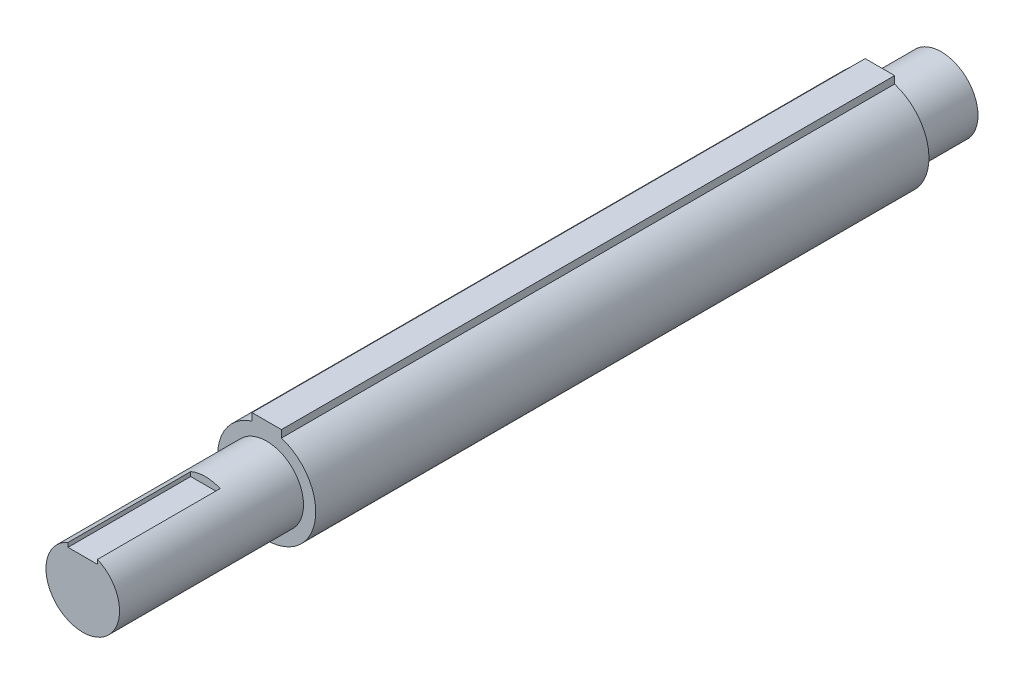
ISO-10303-21;
HEADER;
FILE_DESCRIPTION(('STEP AP214'),'2;1');
FILE_NAME('part.step','',(''),(''),'','','');
FILE_SCHEMA(('AUTOMOTIVE_DESIGN { 1 0 10303 214 1 1 1 1 }'));
ENDSEC;
DATA;
#1=APPLICATION_CONTEXT('core data for automotive mechanical design processes');
#2=APPLICATION_PROTOCOL_DEFINITION('international standard','automotive_design',2000,#1);
#3=PRODUCT_CONTEXT('',#1,'mechanical');
#4=PRODUCT('Part','Part','',(#3));
#5=PRODUCT_RELATED_PRODUCT_CATEGORY('part','',(#4));
#6=PRODUCT_DEFINITION_FORMATION('','',#4);
#7=PRODUCT_DEFINITION_CONTEXT('part definition',#1,'design');
#8=PRODUCT_DEFINITION('design','',#6,#7);
#9=PRODUCT_DEFINITION_SHAPE('','',#8);
#10=(LENGTH_UNIT() NAMED_UNIT(*) SI_UNIT(.MILLI.,.METRE.));
#11=(NAMED_UNIT(*) PLANE_ANGLE_UNIT() SI_UNIT($,.RADIAN.));
#12=(NAMED_UNIT(*) SI_UNIT($,.STERADIAN.) SOLID_ANGLE_UNIT());
#13=UNCERTAINTY_MEASURE_WITH_UNIT(LENGTH_MEASURE(1.E-05),#10,'distance_accuracy_value','');
#14=(GEOMETRIC_REPRESENTATION_CONTEXT(3) GLOBAL_UNCERTAINTY_ASSIGNED_CONTEXT((#13)) GLOBAL_UNIT_ASSIGNED_CONTEXT((#10,
#11,#12)) REPRESENTATION_CONTEXT('',''));
#15=CARTESIAN_POINT('',(0.,0.,0.));
#16=DIRECTION('',(0.,0.,1.));
#17=DIRECTION('',(1.,0.,0.));
#18=AXIS2_PLACEMENT_3D('',#15,#16,#17);
#19=CARTESIAN_POINT('',(0.,22.0787845570902,-250.));
#20=DIRECTION('',(0.,1.,0.));
#21=DIRECTION('',(0.,0.,1.));
#22=AXIS2_PLACEMENT_3D('',#19,#20,#21);
#23=PLANE('',#22);
#24=DIRECTION('',(-1.,0.,0.));
#25=VECTOR('',#24,1.);
#26=CARTESIAN_POINT('',(0.,22.0787845570902,0.));
#27=LINE('',#26,#25);
#28=CARTESIAN_POINT('',(5.99999837823275,22.0787845570902,0.));
#29=VERTEX_POINT('',#28);
#30=CARTESIAN_POINT('',(-6.00000162176725,22.0787845570902,0.));
#31=VERTEX_POINT('',#30);
#32=EDGE_CURVE('E144',#29,#31,#27,.T.);
#33=ORIENTED_EDGE('',*,*,#32,.F.);
#34=DIRECTION('',(0.,0.,1.));
#35=VECTOR('',#34,1.);
#36=CARTESIAN_POINT('',(5.99999837823275,22.0787845570902,-250.));
#37=LINE('',#36,#35);
#38=CARTESIAN_POINT('',(5.99999837823275,22.0787845570902,-250.));
#39=VERTEX_POINT('',#38);
#40=EDGE_CURVE('E57',#39,#29,#37,.T.);
#41=ORIENTED_EDGE('',*,*,#40,.F.);
#42=DIRECTION('',(-1.,0.,0.));
#43=VECTOR('',#42,1.);
#44=CARTESIAN_POINT('',(0.,22.0787845570902,-250.));
#45=LINE('',#44,#43);
#46=CARTESIAN_POINT('',(-6.00000162176725,22.0787845570902,-250.));
#47=VERTEX_POINT('',#46);
#48=EDGE_CURVE('E147',#39,#47,#45,.T.);
#49=ORIENTED_EDGE('',*,*,#48,.T.);
#50=DIRECTION('',(0.,0.,1.));
#51=VECTOR('',#50,1.);
#52=CARTESIAN_POINT('',(-6.00000162176725,22.0787845570902,-250.));
#53=LINE('',#52,#51);
#54=EDGE_CURVE('E156',#47,#31,#53,.T.);
#55=ORIENTED_EDGE('',*,*,#54,.T.);
#56=EDGE_LOOP('',(#33,#41,#49,#55));
#57=FACE_BOUND('',#56,.T.);
#58=ADVANCED_FACE('F34',(#57),#23,.T.);
#59=CARTESIAN_POINT('',(5.99999793993263,-1.19109809559216E-07,-250.));
#60=DIRECTION('',(1.,-1.98516417424892E-08,0.));
#61=DIRECTION('',(1.98516417424892E-08,1.,0.));
#62=AXIS2_PLACEMENT_3D('',#59,#60,#61);
#63=PLANE('',#62);
#64=DIRECTION('',(1.98516417424892E-08,1.,0.));
#65=VECTOR('',#64,1.);
#66=CARTESIAN_POINT('',(5.99999793993263,-1.19109809559216E-07,0.));
#67=LINE('',#66,#65);
#68=CARTESIAN_POINT('',(5.99999831867783,19.0787845570902,0.));
#69=VERTEX_POINT('',#68);
#70=EDGE_CURVE('E149',#69,#29,#67,.T.);
#71=ORIENTED_EDGE('',*,*,#70,.F.);
#72=DIRECTION('',(0.,0.,1.));
#73=VECTOR('',#72,1.);
#74=CARTESIAN_POINT('',(5.99999831867783,19.0787845570902,-250.));
#75=LINE('',#74,#73);
#76=CARTESIAN_POINT('',(5.99999831867783,19.0787845570902,-250.));
#77=VERTEX_POINT('',#76);
#78=EDGE_CURVE('E169',#77,#69,#75,.T.);
#79=ORIENTED_EDGE('',*,*,#78,.F.);
#80=DIRECTION('',(1.98516417424892E-08,1.,0.));
#81=VECTOR('',#80,1.);
#82=CARTESIAN_POINT('',(5.99999793993263,-1.19109809559216E-07,-250.));
#83=LINE('',#82,#81);
#84=EDGE_CURVE('E154',#77,#39,#83,.T.);
#85=ORIENTED_EDGE('',*,*,#84,.T.);
#86=ORIENTED_EDGE('',*,*,#40,.T.);
#87=EDGE_LOOP('',(#71,#79,#85,#86));
#88=FACE_BOUND('',#87,.T.);
#89=ADVANCED_FACE('F185',(#88),#63,.T.);
#90=CARTESIAN_POINT('',(0.,0.,-250.));
#91=DIRECTION('',(0.,0.,1.));
#92=DIRECTION('',(1.,0.,0.));
#93=AXIS2_PLACEMENT_3D('',#90,#91,#92);
#94=CYLINDRICAL_SURFACE('',#93,20.);
#95=CARTESIAN_POINT('',(0.,0.,0.));
#96=DIRECTION('',(0.,0.,1.));
#97=DIRECTION('',(1.,0.,0.));
#98=AXIS2_PLACEMENT_3D('',#95,#96,#97);
#99=CIRCLE('',#98,20.);
#100=CARTESIAN_POINT('',(-6.00000168132219,19.0787834995875,0.));
#101=VERTEX_POINT('',#100);
#102=EDGE_CURVE('E162',#101,#69,#99,.T.);
#103=ORIENTED_EDGE('',*,*,#102,.F.);
#104=DIRECTION('',(0.,0.,1.));
#105=VECTOR('',#104,1.);
#106=CARTESIAN_POINT('',(-6.00000168132219,19.0787834995875,-250.));
#107=LINE('',#106,#105);
#108=CARTESIAN_POINT('',(-6.00000168132219,19.0787834995875,-250.));
#109=VERTEX_POINT('',#108);
#110=EDGE_CURVE('E171',#109,#101,#107,.T.);
#111=ORIENTED_EDGE('',*,*,#110,.F.);
#112=CARTESIAN_POINT('',(0.,0.,-250.));
#113=DIRECTION('',(0.,0.,1.));
#114=DIRECTION('',(1.,0.,0.));
#115=AXIS2_PLACEMENT_3D('',#112,#113,#114);
#116=CIRCLE('',#115,20.);
#117=EDGE_CURVE('E151',#109,#77,#116,.T.);
#118=ORIENTED_EDGE('',*,*,#117,.T.);
#119=ORIENTED_EDGE('',*,*,#78,.T.);
#120=EDGE_LOOP('',(#103,#111,#118,#119));
#121=FACE_BOUND('',#120,.T.);
#122=ADVANCED_FACE('F188',(#121),#94,.T.);
#123=CARTESIAN_POINT('',(-6.00000206006735,1.1910988752824E-07,-250.));
#124=DIRECTION('',(1.,-1.98516411054203E-08,0.));
#125=DIRECTION('',(1.98516411054203E-08,1.,0.));
#126=AXIS2_PLACEMENT_3D('',#123,#124,#125);
#127=PLANE('',#126);
#128=DIRECTION('',(1.98516411054203E-08,1.,0.));
#129=VECTOR('',#128,1.);
#130=CARTESIAN_POINT('',(-6.00000206006735,1.1910988752824E-07,0.));
#131=LINE('',#130,#129);
#132=EDGE_CURVE('E159',#101,#31,#131,.T.);
#133=ORIENTED_EDGE('',*,*,#132,.T.);
#134=ORIENTED_EDGE('',*,*,#54,.F.);
#135=DIRECTION('',(1.98516411054203E-08,1.,0.));
#136=VECTOR('',#135,1.);
#137=CARTESIAN_POINT('',(-6.00000206006735,1.1910988752824E-07,-250.));
#138=LINE('',#137,#136);
#139=EDGE_CURVE('E83',#109,#47,#138,.T.);
#140=ORIENTED_EDGE('',*,*,#139,.F.);
#141=ORIENTED_EDGE('',*,*,#110,.T.);
#142=EDGE_LOOP('',(#133,#134,#140,#141));
#143=FACE_BOUND('',#142,.T.);
#144=ADVANCED_FACE('F182',(#143),#127,.F.);
#145=CARTESIAN_POINT('',(0.,0.,-250.));
#146=DIRECTION('',(0.,0.,1.));
#147=DIRECTION('',(1.,0.,0.));
#148=AXIS2_PLACEMENT_3D('',#145,#146,#147);
#149=PLANE('',#148);
#150=CARTESIAN_POINT('',(0.,0.,-250.));
#151=DIRECTION('',(0.,0.,1.));
#152=DIRECTION('',(1.,0.,0.));
#153=AXIS2_PLACEMENT_3D('',#150,#151,#152);
#154=CIRCLE('',#153,15.);
#155=CARTESIAN_POINT('',(15.,0.,-250.));
#156=VERTEX_POINT('',#155);
#157=EDGE_CURVE('E168',#156,#156,#154,.F.);
#158=ORIENTED_EDGE('',*,*,#157,.F.);
#159=EDGE_LOOP('',(#158));
#160=FACE_BOUND('',#159,.T.);
#161=ORIENTED_EDGE('',*,*,#48,.F.);
#162=ORIENTED_EDGE('',*,*,#84,.F.);
#163=ORIENTED_EDGE('',*,*,#117,.F.);
#164=ORIENTED_EDGE('',*,*,#139,.T.);
#165=EDGE_LOOP('',(#161,#162,#163,#164));
#166=FACE_BOUND('',#165,.T.);
#167=ADVANCED_FACE('F179',(#160,#166),#149,.F.);
#168=CARTESIAN_POINT('',(0.,0.,0.));
#169=DIRECTION('',(0.,0.,1.));
#170=DIRECTION('',(1.,0.,0.));
#171=AXIS2_PLACEMENT_3D('',#168,#169,#170);
#172=PLANE('',#171);
#173=CARTESIAN_POINT('',(0.,0.,0.));
#174=DIRECTION('',(0.,0.,1.));
#175=DIRECTION('',(1.,0.,0.));
#176=AXIS2_PLACEMENT_3D('',#173,#174,#175);
#177=CIRCLE('',#176,15.);
#178=CARTESIAN_POINT('',(15.,0.,0.));
#179=VERTEX_POINT('',#178);
#180=EDGE_CURVE('E140',#179,#179,#177,.T.);
#181=ORIENTED_EDGE('',*,*,#180,.F.);
#182=EDGE_LOOP('',(#181));
#183=FACE_BOUND('',#182,.T.);
#184=ORIENTED_EDGE('',*,*,#32,.T.);
#185=ORIENTED_EDGE('',*,*,#132,.F.);
#186=ORIENTED_EDGE('',*,*,#102,.T.);
#187=ORIENTED_EDGE('',*,*,#70,.T.);
#188=EDGE_LOOP('',(#184,#185,#186,#187));
#189=FACE_BOUND('',#188,.T.);
#190=ADVANCED_FACE('F181',(#183,#189),#172,.T.);
#191=CARTESIAN_POINT('',(0.,0.,75.));
#192=DIRECTION('',(0.,0.,-1.));
#193=DIRECTION('',(-1.,0.,0.));
#194=AXIS2_PLACEMENT_3D('',#191,#192,#193);
#195=CYLINDRICAL_SURFACE('',#194,15.);
#196=CARTESIAN_POINT('',(0.,0.,25.));
#197=DIRECTION('',(0.,0.,-1.));
#198=DIRECTION('',(-1.,0.,0.));
#199=AXIS2_PLACEMENT_3D('',#196,#197,#198);
#200=CIRCLE('',#199,15.);
#201=CARTESIAN_POINT('',(-6.,13.7477270848675,25.));
#202=VERTEX_POINT('',#201);
#203=CARTESIAN_POINT('',(6.,13.7477270848675,25.));
#204=VERTEX_POINT('',#203);
#205=EDGE_CURVE('E11',#202,#204,#200,.T.);
#206=ORIENTED_EDGE('',*,*,#205,.T.);
#207=DIRECTION('',(0.,0.,-1.));
#208=VECTOR('',#207,1.);
#209=CARTESIAN_POINT('',(6.,13.7477270848675,75.));
#210=LINE('',#209,#208);
#211=CARTESIAN_POINT('',(6.,13.7477270848675,75.));
#212=VERTEX_POINT('',#211);
#213=EDGE_CURVE('E134',#204,#212,#210,.F.);
#214=ORIENTED_EDGE('',*,*,#213,.T.);
#215=CARTESIAN_POINT('',(0.,0.,75.));
#216=DIRECTION('',(0.,0.,1.));
#217=DIRECTION('',(1.,0.,0.));
#218=AXIS2_PLACEMENT_3D('',#215,#216,#217);
#219=CIRCLE('',#218,15.);
#220=CARTESIAN_POINT('',(-6.,13.7477270848675,75.));
#221=VERTEX_POINT('',#220);
#222=EDGE_CURVE('E141',#221,#212,#219,.T.);
#223=ORIENTED_EDGE('',*,*,#222,.F.);
#224=DIRECTION('',(0.,0.,-1.));
#225=VECTOR('',#224,1.);
#226=CARTESIAN_POINT('',(-6.,13.7477270848675,75.));
#227=LINE('',#226,#225);
#228=EDGE_CURVE('E48',#221,#202,#227,.T.);
#229=ORIENTED_EDGE('',*,*,#228,.T.);
#230=EDGE_LOOP('',(#206,#214,#223,#229));
#231=FACE_BOUND('',#230,.T.);
#232=ORIENTED_EDGE('',*,*,#180,.T.);
#233=EDGE_LOOP('',(#232));
#234=FACE_BOUND('',#233,.T.);
#235=ADVANCED_FACE('F193',(#231,#234),#195,.T.);
#236=CARTESIAN_POINT('',(0.,0.,75.));
#237=DIRECTION('',(0.,0.,1.));
#238=DIRECTION('',(1.,0.,0.));
#239=AXIS2_PLACEMENT_3D('',#236,#237,#238);
#240=PLANE('',#239);
#241=DIRECTION('',(0.,1.,0.));
#242=VECTOR('',#241,1.);
#243=CARTESIAN_POINT('',(6.,12.,75.));
#244=LINE('',#243,#242);
#245=CARTESIAN_POINT('',(6.,12.,75.));
#246=VERTEX_POINT('',#245);
#247=EDGE_CURVE('E128',#246,#212,#244,.T.);
#248=ORIENTED_EDGE('',*,*,#247,.F.);
#249=DIRECTION('',(1.,0.,0.));
#250=VECTOR('',#249,1.);
#251=CARTESIAN_POINT('',(-6.,12.,75.));
#252=LINE('',#251,#250);
#253=CARTESIAN_POINT('',(-6.,12.,75.));
#254=VERTEX_POINT('',#253);
#255=EDGE_CURVE('E130',#254,#246,#252,.T.);
#256=ORIENTED_EDGE('',*,*,#255,.F.);
#257=DIRECTION('',(0.,-1.,0.));
#258=VECTOR('',#257,1.);
#259=CARTESIAN_POINT('',(-6.,0.,75.));
#260=LINE('',#259,#258);
#261=EDGE_CURVE('E41',#221,#254,#260,.T.);
#262=ORIENTED_EDGE('',*,*,#261,.F.);
#263=ORIENTED_EDGE('',*,*,#222,.T.);
#264=EDGE_LOOP('',(#248,#256,#262,#263));
#265=FACE_BOUND('',#264,.T.);
#266=ADVANCED_FACE('F199',(#265),#240,.T.);
#267=CARTESIAN_POINT('',(0.,0.,-275.));
#268=DIRECTION('',(0.,0.,1.));
#269=DIRECTION('',(1.,0.,0.));
#270=AXIS2_PLACEMENT_3D('',#267,#268,#269);
#271=CYLINDRICAL_SURFACE('',#270,15.);
#272=CARTESIAN_POINT('',(0.,0.,-275.));
#273=DIRECTION('',(0.,0.,-1.));
#274=DIRECTION('',(-1.,0.,0.));
#275=AXIS2_PLACEMENT_3D('',#272,#273,#274);
#276=CIRCLE('',#275,15.);
#277=CARTESIAN_POINT('',(-15.,0.,-275.));
#278=VERTEX_POINT('',#277);
#279=EDGE_CURVE('E137',#278,#278,#276,.T.);
#280=ORIENTED_EDGE('',*,*,#279,.F.);
#281=EDGE_LOOP('',(#280));
#282=FACE_BOUND('',#281,.T.);
#283=ORIENTED_EDGE('',*,*,#157,.T.);
#284=EDGE_LOOP('',(#283));
#285=FACE_BOUND('',#284,.T.);
#286=ADVANCED_FACE('F177',(#282,#285),#271,.T.);
#287=CARTESIAN_POINT('',(0.,0.,-275.));
#288=DIRECTION('',(0.,0.,-1.));
#289=DIRECTION('',(-1.,0.,0.));
#290=AXIS2_PLACEMENT_3D('',#287,#288,#289);
#291=PLANE('',#290);
#292=ORIENTED_EDGE('',*,*,#279,.T.);
#293=EDGE_LOOP('',(#292));
#294=FACE_BOUND('',#293,.T.);
#295=ADVANCED_FACE('F234',(#294),#291,.T.);
#296=CARTESIAN_POINT('',(0.,0.,25.));
#297=DIRECTION('',(0.,0.,-1.));
#298=DIRECTION('',(-1.,0.,0.));
#299=AXIS2_PLACEMENT_3D('',#296,#297,#298);
#300=PLANE('',#299);
#301=DIRECTION('',(0.,-1.,0.));
#302=VECTOR('',#301,1.);
#303=CARTESIAN_POINT('',(-6.,12.,25.));
#304=LINE('',#303,#302);
#305=CARTESIAN_POINT('',(-6.,12.,25.));
#306=VERTEX_POINT('',#305);
#307=EDGE_CURVE('E107',#202,#306,#304,.T.);
#308=ORIENTED_EDGE('',*,*,#307,.T.);
#309=DIRECTION('',(1.,0.,0.));
#310=VECTOR('',#309,1.);
#311=CARTESIAN_POINT('',(-6.,12.,25.));
#312=LINE('',#311,#310);
#313=CARTESIAN_POINT('',(6.,12.,25.));
#314=VERTEX_POINT('',#313);
#315=EDGE_CURVE('E112',#306,#314,#312,.T.);
#316=ORIENTED_EDGE('',*,*,#315,.T.);
#317=DIRECTION('',(0.,1.,0.));
#318=VECTOR('',#317,1.);
#319=CARTESIAN_POINT('',(6.,12.,25.));
#320=LINE('',#319,#318);
#321=EDGE_CURVE('E113',#314,#204,#320,.T.);
#322=ORIENTED_EDGE('',*,*,#321,.T.);
#323=ORIENTED_EDGE('',*,*,#205,.F.);
#324=EDGE_LOOP('',(#308,#316,#322,#323));
#325=FACE_BOUND('',#324,.T.);
#326=ADVANCED_FACE('F109',(#325),#300,.F.);
#327=CARTESIAN_POINT('',(6.,12.,25.));
#328=DIRECTION('',(1.,0.,0.));
#329=DIRECTION('',(0.,0.,-1.));
#330=AXIS2_PLACEMENT_3D('',#327,#328,#329);
#331=PLANE('',#330);
#332=ORIENTED_EDGE('',*,*,#321,.F.);
#333=DIRECTION('',(0.,0.,1.));
#334=VECTOR('',#333,1.);
#335=CARTESIAN_POINT('',(6.,12.,25.));
#336=LINE('',#335,#334);
#337=EDGE_CURVE('E121',#314,#246,#336,.T.);
#338=ORIENTED_EDGE('',*,*,#337,.T.);
#339=ORIENTED_EDGE('',*,*,#247,.T.);
#340=ORIENTED_EDGE('',*,*,#213,.F.);
#341=EDGE_LOOP('',(#332,#338,#339,#340));
#342=FACE_BOUND('',#341,.T.);
#343=ADVANCED_FACE('F268',(#342),#331,.F.);
#344=CARTESIAN_POINT('',(-6.,12.,25.));
#345=DIRECTION('',(-1.,0.,0.));
#346=DIRECTION('',(0.,0.,1.));
#347=AXIS2_PLACEMENT_3D('',#344,#345,#346);
#348=PLANE('',#347);
#349=ORIENTED_EDGE('',*,*,#261,.T.);
#350=DIRECTION('',(0.,0.,1.));
#351=VECTOR('',#350,1.);
#352=CARTESIAN_POINT('',(-6.,12.,25.));
#353=LINE('',#352,#351);
#354=EDGE_CURVE('E116',#306,#254,#353,.T.);
#355=ORIENTED_EDGE('',*,*,#354,.F.);
#356=ORIENTED_EDGE('',*,*,#307,.F.);
#357=ORIENTED_EDGE('',*,*,#228,.F.);
#358=EDGE_LOOP('',(#349,#355,#356,#357));
#359=FACE_BOUND('',#358,.T.);
#360=ADVANCED_FACE('F117',(#359),#348,.F.);
#361=CARTESIAN_POINT('',(-6.,12.,25.));
#362=DIRECTION('',(0.,-1.,0.));
#363=DIRECTION('',(0.,0.,-1.));
#364=AXIS2_PLACEMENT_3D('',#361,#362,#363);
#365=PLANE('',#364);
#366=ORIENTED_EDGE('',*,*,#255,.T.);
#367=ORIENTED_EDGE('',*,*,#337,.F.);
#368=ORIENTED_EDGE('',*,*,#315,.F.);
#369=ORIENTED_EDGE('',*,*,#354,.T.);
#370=EDGE_LOOP('',(#366,#367,#368,#369));
#371=FACE_BOUND('',#370,.T.);
#372=ADVANCED_FACE('F123',(#371),#365,.F.);
#373=CLOSED_SHELL('',(#58,#89,#122,#144,#167,#190,#235,#266,#286,#295,#326,#343,#360,#372));
#374=MANIFOLD_SOLID_BREP('B2',#373);
#375=ADVANCED_BREP_SHAPE_REPRESENTATION('',(#18,#374),#14);
#376=SHAPE_DEFINITION_REPRESENTATION(#9,#375);
ENDSEC;
END-ISO-10303-21;
